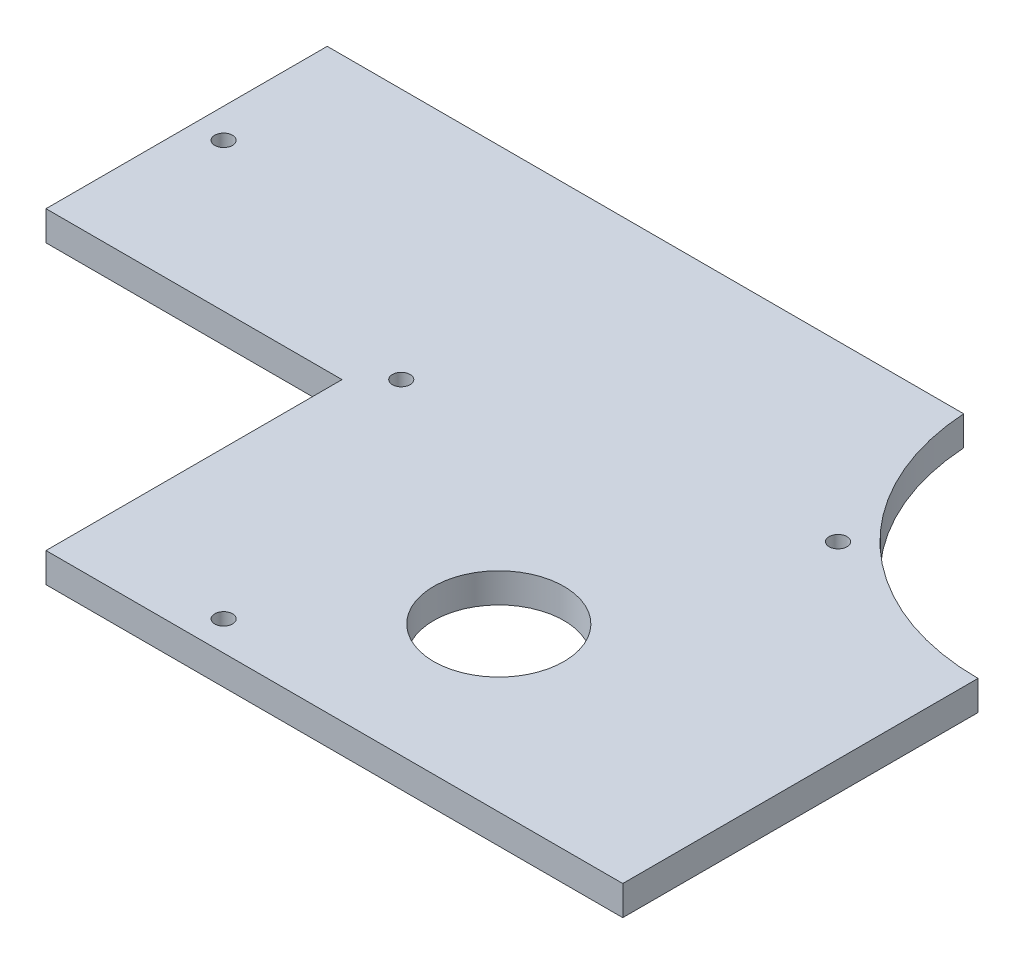
ISO-10303-21;
HEADER;
FILE_DESCRIPTION(('STEP AP214'),'2;1');
FILE_NAME('part.step','',(''),(''),'','','');
FILE_SCHEMA(('AUTOMOTIVE_DESIGN { 1 0 10303 214 1 1 1 1 }'));
ENDSEC;
DATA;
#1=APPLICATION_CONTEXT('core data for automotive mechanical design processes');
#2=APPLICATION_PROTOCOL_DEFINITION('international standard','automotive_design',2000,#1);
#3=PRODUCT_CONTEXT('',#1,'mechanical');
#4=PRODUCT('Part','Part','',(#3));
#5=PRODUCT_RELATED_PRODUCT_CATEGORY('part','',(#4));
#6=PRODUCT_DEFINITION_FORMATION('','',#4);
#7=PRODUCT_DEFINITION_CONTEXT('part definition',#1,'design');
#8=PRODUCT_DEFINITION('design','',#6,#7);
#9=PRODUCT_DEFINITION_SHAPE('','',#8);
#10=(LENGTH_UNIT() NAMED_UNIT(*) SI_UNIT(.MILLI.,.METRE.));
#11=(NAMED_UNIT(*) PLANE_ANGLE_UNIT() SI_UNIT($,.RADIAN.));
#12=(NAMED_UNIT(*) SI_UNIT($,.STERADIAN.) SOLID_ANGLE_UNIT());
#13=UNCERTAINTY_MEASURE_WITH_UNIT(LENGTH_MEASURE(1.E-05),#10,'distance_accuracy_value','');
#14=(GEOMETRIC_REPRESENTATION_CONTEXT(3) GLOBAL_UNCERTAINTY_ASSIGNED_CONTEXT((#13)) GLOBAL_UNIT_ASSIGNED_CONTEXT((#10,
#11,#12)) REPRESENTATION_CONTEXT('',''));
#15=CARTESIAN_POINT('',(0.,0.,0.));
#16=DIRECTION('',(0.,0.,1.));
#17=DIRECTION('',(1.,0.,0.));
#18=AXIS2_PLACEMENT_3D('',#15,#16,#17);
#19=CARTESIAN_POINT('',(0.,5.,-2.585));
#20=DIRECTION('',(0.,-1.,0.));
#21=DIRECTION('',(0.,0.,-1.));
#22=AXIS2_PLACEMENT_3D('',#19,#20,#21);
#23=CYLINDRICAL_SURFACE('',#22,40.);
#24=CARTESIAN_POINT('',(0.,0.,-2.585));
#25=DIRECTION('',(0.,1.,0.));
#26=DIRECTION('',(0.,0.,1.));
#27=AXIS2_PLACEMENT_3D('',#24,#25,#26);
#28=CIRCLE('',#27,40.);
#29=CARTESIAN_POINT('',(-39.9217985566783,0.,-0.0849999999999901));
#30=VERTEX_POINT('',#29);
#31=CARTESIAN_POINT('',(0.,0.,37.415));
#32=VERTEX_POINT('',#31);
#33=EDGE_CURVE('E139',#30,#32,#28,.T.);
#34=ORIENTED_EDGE('',*,*,#33,.F.);
#35=DIRECTION('',(0.,-1.,0.));
#36=VECTOR('',#35,1.);
#37=CARTESIAN_POINT('',(-39.9217985566783,5.,-0.0849999999999901));
#38=LINE('',#37,#36);
#39=CARTESIAN_POINT('',(-39.9217985566783,5.,-0.0849999999999901));
#40=VERTEX_POINT('',#39);
#41=EDGE_CURVE('E11',#40,#30,#38,.T.);
#42=ORIENTED_EDGE('',*,*,#41,.F.);
#43=CARTESIAN_POINT('',(0.,5.,-2.585));
#44=DIRECTION('',(0.,1.,0.));
#45=DIRECTION('',(0.,0.,1.));
#46=AXIS2_PLACEMENT_3D('',#43,#44,#45);
#47=CIRCLE('',#46,40.);
#48=CARTESIAN_POINT('',(0.,5.,37.415));
#49=VERTEX_POINT('',#48);
#50=EDGE_CURVE('E188',#40,#49,#47,.T.);
#51=ORIENTED_EDGE('',*,*,#50,.T.);
#52=DIRECTION('',(0.,-1.,0.));
#53=VECTOR('',#52,1.);
#54=CARTESIAN_POINT('',(0.,5.,37.415));
#55=LINE('',#54,#53);
#56=EDGE_CURVE('E83',#49,#32,#55,.T.);
#57=ORIENTED_EDGE('',*,*,#56,.T.);
#58=EDGE_LOOP('',(#34,#42,#51,#57));
#59=FACE_BOUND('',#58,.T.);
#60=ADVANCED_FACE('F35',(#59),#23,.F.);
#61=CARTESIAN_POINT('',(0.,5.,-0.0849999999999924));
#62=DIRECTION('',(0.,0.,-1.));
#63=DIRECTION('',(-1.,0.,0.));
#64=AXIS2_PLACEMENT_3D('',#61,#62,#63);
#65=PLANE('',#64);
#66=DIRECTION('',(1.,0.,0.));
#67=VECTOR('',#66,1.);
#68=CARTESIAN_POINT('',(0.,0.,-0.0849999999999924));
#69=LINE('',#68,#67);
#70=CARTESIAN_POINT('',(-147.415,0.,-0.0849999999999878));
#71=VERTEX_POINT('',#70);
#72=EDGE_CURVE('E142',#71,#30,#69,.T.);
#73=ORIENTED_EDGE('',*,*,#72,.F.);
#74=DIRECTION('',(0.,-1.,0.));
#75=VECTOR('',#74,1.);
#76=CARTESIAN_POINT('',(-147.415,5.,-0.0849999999999878));
#77=LINE('',#76,#75);
#78=CARTESIAN_POINT('',(-147.415,5.,-0.0849999999999878));
#79=VERTEX_POINT('',#78);
#80=EDGE_CURVE('E44',#79,#71,#77,.T.);
#81=ORIENTED_EDGE('',*,*,#80,.F.);
#82=DIRECTION('',(1.,0.,0.));
#83=VECTOR('',#82,1.);
#84=CARTESIAN_POINT('',(0.,5.,-0.0849999999999924));
#85=LINE('',#84,#83);
#86=EDGE_CURVE('E186',#79,#40,#85,.T.);
#87=ORIENTED_EDGE('',*,*,#86,.T.);
#88=ORIENTED_EDGE('',*,*,#41,.T.);
#89=EDGE_LOOP('',(#73,#81,#87,#88));
#90=FACE_BOUND('',#89,.T.);
#91=ADVANCED_FACE('F179',(#90),#65,.T.);
#92=CARTESIAN_POINT('',(-147.415,5.,0.));
#93=DIRECTION('',(-1.,0.,0.));
#94=DIRECTION('',(0.,0.,1.));
#95=AXIS2_PLACEMENT_3D('',#92,#93,#94);
#96=PLANE('',#95);
#97=DIRECTION('',(0.,0.,-1.));
#98=VECTOR('',#97,1.);
#99=CARTESIAN_POINT('',(-147.415,0.,0.));
#100=LINE('',#99,#98);
#101=CARTESIAN_POINT('',(-147.415,0.,47.415));
#102=VERTEX_POINT('',#101);
#103=EDGE_CURVE('E145',#102,#71,#100,.T.);
#104=ORIENTED_EDGE('',*,*,#103,.F.);
#105=DIRECTION('',(0.,-1.,0.));
#106=VECTOR('',#105,1.);
#107=CARTESIAN_POINT('',(-147.415,5.,47.415));
#108=LINE('',#107,#106);
#109=CARTESIAN_POINT('',(-147.415,5.,47.415));
#110=VERTEX_POINT('',#109);
#111=EDGE_CURVE('E169',#110,#102,#108,.T.);
#112=ORIENTED_EDGE('',*,*,#111,.F.);
#113=DIRECTION('',(0.,0.,-1.));
#114=VECTOR('',#113,1.);
#115=CARTESIAN_POINT('',(-147.415,5.,0.));
#116=LINE('',#115,#114);
#117=EDGE_CURVE('E175',#110,#79,#116,.T.);
#118=ORIENTED_EDGE('',*,*,#117,.T.);
#119=ORIENTED_EDGE('',*,*,#80,.T.);
#120=EDGE_LOOP('',(#104,#112,#118,#119));
#121=FACE_BOUND('',#120,.T.);
#122=ADVANCED_FACE('F174',(#121),#96,.T.);
#123=CARTESIAN_POINT('',(0.,5.,47.4149999999999));
#124=DIRECTION('',(0.,0.,-1.));
#125=DIRECTION('',(-1.,0.,0.));
#126=AXIS2_PLACEMENT_3D('',#123,#124,#125);
#127=PLANE('',#126);
#128=DIRECTION('',(1.,0.,0.));
#129=VECTOR('',#128,1.);
#130=CARTESIAN_POINT('',(0.,0.,47.4149999999999));
#131=LINE('',#130,#129);
#132=CARTESIAN_POINT('',(-97.415,0.,47.415));
#133=VERTEX_POINT('',#132);
#134=EDGE_CURVE('E148',#102,#133,#131,.T.);
#135=ORIENTED_EDGE('',*,*,#134,.T.);
#136=DIRECTION('',(0.,-1.,0.));
#137=VECTOR('',#136,1.);
#138=CARTESIAN_POINT('',(-97.415,5.,47.415));
#139=LINE('',#138,#137);
#140=CARTESIAN_POINT('',(-97.415,5.,47.415));
#141=VERTEX_POINT('',#140);
#142=EDGE_CURVE('E117',#141,#133,#139,.T.);
#143=ORIENTED_EDGE('',*,*,#142,.F.);
#144=DIRECTION('',(1.,0.,0.));
#145=VECTOR('',#144,1.);
#146=CARTESIAN_POINT('',(0.,5.,47.4149999999999));
#147=LINE('',#146,#145);
#148=EDGE_CURVE('E105',#110,#141,#147,.T.);
#149=ORIENTED_EDGE('',*,*,#148,.F.);
#150=ORIENTED_EDGE('',*,*,#111,.T.);
#151=EDGE_LOOP('',(#135,#143,#149,#150));
#152=FACE_BOUND('',#151,.T.);
#153=ADVANCED_FACE('F185',(#152),#127,.F.);
#154=CARTESIAN_POINT('',(-97.415,5.,0.));
#155=DIRECTION('',(1.,0.,0.));
#156=DIRECTION('',(0.,0.,-1.));
#157=AXIS2_PLACEMENT_3D('',#154,#155,#156);
#158=PLANE('',#157);
#159=DIRECTION('',(0.,0.,1.));
#160=VECTOR('',#159,1.);
#161=CARTESIAN_POINT('',(-97.415,0.,0.));
#162=LINE('',#161,#160);
#163=CARTESIAN_POINT('',(-97.415,0.,97.415));
#164=VERTEX_POINT('',#163);
#165=EDGE_CURVE('E113',#133,#164,#162,.T.);
#166=ORIENTED_EDGE('',*,*,#165,.T.);
#167=DIRECTION('',(0.,-1.,0.));
#168=VECTOR('',#167,1.);
#169=CARTESIAN_POINT('',(-97.415,5.,97.415));
#170=LINE('',#169,#168);
#171=CARTESIAN_POINT('',(-97.415,5.,97.415));
#172=VERTEX_POINT('',#171);
#173=EDGE_CURVE('E111',#172,#164,#170,.T.);
#174=ORIENTED_EDGE('',*,*,#173,.F.);
#175=DIRECTION('',(0.,0.,1.));
#176=VECTOR('',#175,1.);
#177=CARTESIAN_POINT('',(-97.415,5.,0.));
#178=LINE('',#177,#176);
#179=EDGE_CURVE('E97',#141,#172,#178,.T.);
#180=ORIENTED_EDGE('',*,*,#179,.F.);
#181=ORIENTED_EDGE('',*,*,#142,.T.);
#182=EDGE_LOOP('',(#166,#174,#180,#181));
#183=FACE_BOUND('',#182,.T.);
#184=ADVANCED_FACE('F112',(#183),#158,.F.);
#185=CARTESIAN_POINT('',(0.,5.,97.4149999999999));
#186=DIRECTION('',(0.,0.,1.));
#187=DIRECTION('',(1.,0.,0.));
#188=AXIS2_PLACEMENT_3D('',#185,#186,#187);
#189=PLANE('',#188);
#190=DIRECTION('',(-1.,0.,0.));
#191=VECTOR('',#190,1.);
#192=CARTESIAN_POINT('',(0.,0.,97.4149999999999));
#193=LINE('',#192,#191);
#194=CARTESIAN_POINT('',(0.,0.,97.4149999999999));
#195=VERTEX_POINT('',#194);
#196=EDGE_CURVE('E152',#195,#164,#193,.T.);
#197=ORIENTED_EDGE('',*,*,#196,.F.);
#198=DIRECTION('',(0.,-1.,0.));
#199=VECTOR('',#198,1.);
#200=CARTESIAN_POINT('',(0.,5.,97.4149999999999));
#201=LINE('',#200,#199);
#202=CARTESIAN_POINT('',(0.,5.,97.4149999999999));
#203=VERTEX_POINT('',#202);
#204=EDGE_CURVE('E76',#203,#195,#201,.T.);
#205=ORIENTED_EDGE('',*,*,#204,.F.);
#206=DIRECTION('',(-1.,0.,0.));
#207=VECTOR('',#206,1.);
#208=CARTESIAN_POINT('',(0.,5.,97.4149999999999));
#209=LINE('',#208,#207);
#210=EDGE_CURVE('E102',#203,#172,#209,.T.);
#211=ORIENTED_EDGE('',*,*,#210,.T.);
#212=ORIENTED_EDGE('',*,*,#173,.T.);
#213=EDGE_LOOP('',(#197,#205,#211,#212));
#214=FACE_BOUND('',#213,.T.);
#215=ADVANCED_FACE('F119',(#214),#189,.T.);
#216=CARTESIAN_POINT('',(-142.415,5.,22.415));
#217=DIRECTION('',(0.,-1.,0.));
#218=DIRECTION('',(0.,0.,-1.));
#219=AXIS2_PLACEMENT_3D('',#216,#217,#218);
#220=CYLINDRICAL_SURFACE('',#219,1.5);
#221=CARTESIAN_POINT('',(-142.415,5.,22.415));
#222=DIRECTION('',(0.,1.,0.));
#223=DIRECTION('',(0.,0.,1.));
#224=AXIS2_PLACEMENT_3D('',#221,#222,#223);
#225=CIRCLE('',#224,1.5);
#226=CARTESIAN_POINT('',(-142.415,5.,23.915));
#227=VERTEX_POINT('',#226);
#228=EDGE_CURVE('E127',#227,#227,#225,.T.);
#229=ORIENTED_EDGE('',*,*,#228,.T.);
#230=EDGE_LOOP('',(#229));
#231=FACE_BOUND('',#230,.T.);
#232=CARTESIAN_POINT('',(-142.415,0.,22.415));
#233=DIRECTION('',(0.,1.,0.));
#234=DIRECTION('',(0.,0.,1.));
#235=AXIS2_PLACEMENT_3D('',#232,#233,#234);
#236=CIRCLE('',#235,1.5);
#237=CARTESIAN_POINT('',(-142.415,0.,23.915));
#238=VERTEX_POINT('',#237);
#239=EDGE_CURVE('E159',#238,#238,#236,.T.);
#240=ORIENTED_EDGE('',*,*,#239,.F.);
#241=EDGE_LOOP('',(#240));
#242=FACE_BOUND('',#241,.T.);
#243=ADVANCED_FACE('F233',(#231,#242),#220,.F.);
#244=CARTESIAN_POINT('',(-72.4149999999999,5.,92.415));
#245=DIRECTION('',(0.,-1.,0.));
#246=DIRECTION('',(0.,0.,-1.));
#247=AXIS2_PLACEMENT_3D('',#244,#245,#246);
#248=CYLINDRICAL_SURFACE('',#247,1.5);
#249=CARTESIAN_POINT('',(-72.4149999999999,5.,92.415));
#250=DIRECTION('',(0.,1.,0.));
#251=DIRECTION('',(0.,0.,1.));
#252=AXIS2_PLACEMENT_3D('',#249,#250,#251);
#253=CIRCLE('',#252,1.5);
#254=CARTESIAN_POINT('',(-72.4149999999999,5.,93.915));
#255=VERTEX_POINT('',#254);
#256=EDGE_CURVE('E121',#255,#255,#253,.T.);
#257=ORIENTED_EDGE('',*,*,#256,.T.);
#258=EDGE_LOOP('',(#257));
#259=FACE_BOUND('',#258,.T.);
#260=CARTESIAN_POINT('',(-72.4149999999999,0.,92.415));
#261=DIRECTION('',(0.,1.,0.));
#262=DIRECTION('',(0.,0.,1.));
#263=AXIS2_PLACEMENT_3D('',#260,#261,#262);
#264=CIRCLE('',#263,1.5);
#265=CARTESIAN_POINT('',(-72.4149999999999,0.,93.915));
#266=VERTEX_POINT('',#265);
#267=EDGE_CURVE('E156',#266,#266,#264,.T.);
#268=ORIENTED_EDGE('',*,*,#267,.F.);
#269=EDGE_LOOP('',(#268));
#270=FACE_BOUND('',#269,.T.);
#271=ADVANCED_FACE('F236',(#259,#270),#248,.F.);
#272=CARTESIAN_POINT('',(0.,5.,0.));
#273=DIRECTION('',(-1.,0.,0.));
#274=DIRECTION('',(0.,0.,1.));
#275=AXIS2_PLACEMENT_3D('',#272,#273,#274);
#276=PLANE('',#275);
#277=DIRECTION('',(0.,0.,-1.));
#278=VECTOR('',#277,1.);
#279=CARTESIAN_POINT('',(0.,0.,0.));
#280=LINE('',#279,#278);
#281=EDGE_CURVE('E154',#195,#32,#280,.T.);
#282=ORIENTED_EDGE('',*,*,#281,.T.);
#283=ORIENTED_EDGE('',*,*,#56,.F.);
#284=DIRECTION('',(0.,0.,-1.));
#285=VECTOR('',#284,1.);
#286=CARTESIAN_POINT('',(0.,5.,0.));
#287=LINE('',#286,#285);
#288=EDGE_CURVE('E52',#203,#49,#287,.T.);
#289=ORIENTED_EDGE('',*,*,#288,.F.);
#290=ORIENTED_EDGE('',*,*,#204,.T.);
#291=EDGE_LOOP('',(#282,#283,#289,#290));
#292=FACE_BOUND('',#291,.T.);
#293=ADVANCED_FACE('F209',(#292),#276,.F.);
#294=CARTESIAN_POINT('',(-31.8198051533946,5.,29.2348051533946));
#295=DIRECTION('',(0.,-1.,0.));
#296=DIRECTION('',(0.,0.,-1.));
#297=AXIS2_PLACEMENT_3D('',#294,#295,#296);
#298=CYLINDRICAL_SURFACE('',#297,1.49999999999999);
#299=CARTESIAN_POINT('',(-31.8198051533946,5.,29.2348051533946));
#300=DIRECTION('',(0.,1.,0.));
#301=DIRECTION('',(0.,0.,1.));
#302=AXIS2_PLACEMENT_3D('',#299,#300,#301);
#303=CIRCLE('',#302,1.49999999999999);
#304=CARTESIAN_POINT('',(-31.8198051533946,5.,30.7348051533946));
#305=VERTEX_POINT('',#304);
#306=EDGE_CURVE('E192',#305,#305,#303,.T.);
#307=ORIENTED_EDGE('',*,*,#306,.T.);
#308=EDGE_LOOP('',(#307));
#309=FACE_BOUND('',#308,.T.);
#310=CARTESIAN_POINT('',(-31.8198051533946,0.,29.2348051533946));
#311=DIRECTION('',(0.,1.,0.));
#312=DIRECTION('',(0.,0.,1.));
#313=AXIS2_PLACEMENT_3D('',#310,#311,#312);
#314=CIRCLE('',#313,1.49999999999999);
#315=CARTESIAN_POINT('',(-31.8198051533946,0.,30.7348051533946));
#316=VERTEX_POINT('',#315);
#317=EDGE_CURVE('E136',#316,#316,#314,.T.);
#318=ORIENTED_EDGE('',*,*,#317,.F.);
#319=EDGE_LOOP('',(#318));
#320=FACE_BOUND('',#319,.T.);
#321=ADVANCED_FACE('F206',(#309,#320),#298,.F.);
#322=CARTESIAN_POINT('',(-48.4354494302725,5.,69.915));
#323=DIRECTION('',(0.,-1.,0.));
#324=DIRECTION('',(0.,0.,-1.));
#325=AXIS2_PLACEMENT_3D('',#322,#323,#324);
#326=CYLINDRICAL_SURFACE('',#325,11.);
#327=CARTESIAN_POINT('',(-48.4354494302725,5.,69.915));
#328=DIRECTION('',(0.,1.,0.));
#329=DIRECTION('',(0.,0.,1.));
#330=AXIS2_PLACEMENT_3D('',#327,#328,#329);
#331=CIRCLE('',#330,11.);
#332=CARTESIAN_POINT('',(-48.4354494302725,5.,80.915));
#333=VERTEX_POINT('',#332);
#334=EDGE_CURVE('E165',#333,#333,#331,.T.);
#335=ORIENTED_EDGE('',*,*,#334,.T.);
#336=EDGE_LOOP('',(#335));
#337=FACE_BOUND('',#336,.T.);
#338=CARTESIAN_POINT('',(-48.4354494302725,0.,69.915));
#339=DIRECTION('',(0.,1.,0.));
#340=DIRECTION('',(0.,0.,1.));
#341=AXIS2_PLACEMENT_3D('',#338,#339,#340);
#342=CIRCLE('',#341,11.);
#343=CARTESIAN_POINT('',(-48.4354494302725,0.,80.915));
#344=VERTEX_POINT('',#343);
#345=EDGE_CURVE('E133',#344,#344,#342,.T.);
#346=ORIENTED_EDGE('',*,*,#345,.F.);
#347=EDGE_LOOP('',(#346));
#348=FACE_BOUND('',#347,.T.);
#349=ADVANCED_FACE('F37',(#337,#348),#326,.F.);
#350=CARTESIAN_POINT('',(-92.4149999999999,5.,42.415));
#351=DIRECTION('',(0.,-1.,0.));
#352=DIRECTION('',(0.,0.,-1.));
#353=AXIS2_PLACEMENT_3D('',#350,#351,#352);
#354=CYLINDRICAL_SURFACE('',#353,1.5);
#355=CARTESIAN_POINT('',(-92.4149999999999,5.,42.415));
#356=DIRECTION('',(0.,1.,0.));
#357=DIRECTION('',(0.,0.,1.));
#358=AXIS2_PLACEMENT_3D('',#355,#356,#357);
#359=CIRCLE('',#358,1.5);
#360=CARTESIAN_POINT('',(-92.4149999999999,5.,43.915));
#361=VERTEX_POINT('',#360);
#362=EDGE_CURVE('E130',#361,#361,#359,.T.);
#363=ORIENTED_EDGE('',*,*,#362,.T.);
#364=EDGE_LOOP('',(#363));
#365=FACE_BOUND('',#364,.T.);
#366=CARTESIAN_POINT('',(-92.4149999999999,0.,42.415));
#367=DIRECTION('',(0.,1.,0.));
#368=DIRECTION('',(0.,0.,1.));
#369=AXIS2_PLACEMENT_3D('',#366,#367,#368);
#370=CIRCLE('',#369,1.5);
#371=CARTESIAN_POINT('',(-92.4149999999999,0.,43.915));
#372=VERTEX_POINT('',#371);
#373=EDGE_CURVE('E162',#372,#372,#370,.T.);
#374=ORIENTED_EDGE('',*,*,#373,.F.);
#375=EDGE_LOOP('',(#374));
#376=FACE_BOUND('',#375,.T.);
#377=ADVANCED_FACE('F202',(#365,#376),#354,.F.);
#378=CARTESIAN_POINT('',(0.,5.,0.));
#379=DIRECTION('',(0.,1.,0.));
#380=DIRECTION('',(0.,0.,1.));
#381=AXIS2_PLACEMENT_3D('',#378,#379,#380);
#382=PLANE('',#381);
#383=ORIENTED_EDGE('',*,*,#334,.F.);
#384=EDGE_LOOP('',(#383));
#385=FACE_BOUND('',#384,.T.);
#386=ORIENTED_EDGE('',*,*,#306,.F.);
#387=EDGE_LOOP('',(#386));
#388=FACE_BOUND('',#387,.T.);
#389=ORIENTED_EDGE('',*,*,#50,.F.);
#390=ORIENTED_EDGE('',*,*,#86,.F.);
#391=ORIENTED_EDGE('',*,*,#117,.F.);
#392=ORIENTED_EDGE('',*,*,#148,.T.);
#393=ORIENTED_EDGE('',*,*,#179,.T.);
#394=ORIENTED_EDGE('',*,*,#210,.F.);
#395=ORIENTED_EDGE('',*,*,#288,.T.);
#396=EDGE_LOOP('',(#389,#390,#391,#392,#393,#394,#395));
#397=FACE_BOUND('',#396,.T.);
#398=ORIENTED_EDGE('',*,*,#256,.F.);
#399=EDGE_LOOP('',(#398));
#400=FACE_BOUND('',#399,.T.);
#401=ORIENTED_EDGE('',*,*,#228,.F.);
#402=EDGE_LOOP('',(#401));
#403=FACE_BOUND('',#402,.T.);
#404=ORIENTED_EDGE('',*,*,#362,.F.);
#405=EDGE_LOOP('',(#404));
#406=FACE_BOUND('',#405,.T.);
#407=ADVANCED_FACE('F99',(#385,#388,#397,#400,#403,#406),#382,.T.);
#408=CARTESIAN_POINT('',(0.,0.,0.));
#409=DIRECTION('',(0.,1.,0.));
#410=DIRECTION('',(0.,0.,1.));
#411=AXIS2_PLACEMENT_3D('',#408,#409,#410);
#412=PLANE('',#411);
#413=ORIENTED_EDGE('',*,*,#345,.T.);
#414=EDGE_LOOP('',(#413));
#415=FACE_BOUND('',#414,.T.);
#416=ORIENTED_EDGE('',*,*,#317,.T.);
#417=EDGE_LOOP('',(#416));
#418=FACE_BOUND('',#417,.T.);
#419=ORIENTED_EDGE('',*,*,#33,.T.);
#420=ORIENTED_EDGE('',*,*,#281,.F.);
#421=ORIENTED_EDGE('',*,*,#196,.T.);
#422=ORIENTED_EDGE('',*,*,#165,.F.);
#423=ORIENTED_EDGE('',*,*,#134,.F.);
#424=ORIENTED_EDGE('',*,*,#103,.T.);
#425=ORIENTED_EDGE('',*,*,#72,.T.);
#426=EDGE_LOOP('',(#419,#420,#421,#422,#423,#424,#425));
#427=FACE_BOUND('',#426,.T.);
#428=ORIENTED_EDGE('',*,*,#267,.T.);
#429=EDGE_LOOP('',(#428));
#430=FACE_BOUND('',#429,.T.);
#431=ORIENTED_EDGE('',*,*,#239,.T.);
#432=EDGE_LOOP('',(#431));
#433=FACE_BOUND('',#432,.T.);
#434=ORIENTED_EDGE('',*,*,#373,.T.);
#435=EDGE_LOOP('',(#434));
#436=FACE_BOUND('',#435,.T.);
#437=ADVANCED_FACE('F182',(#415,#418,#427,#430,#433,#436),#412,.F.);
#438=CLOSED_SHELL('',(#60,#91,#122,#153,#184,#215,#243,#271,#293,#321,#349,#377,#407,#437));
#439=MANIFOLD_SOLID_BREP('B2',#438);
#440=ADVANCED_BREP_SHAPE_REPRESENTATION('',(#18,#439),#14);
#441=SHAPE_DEFINITION_REPRESENTATION(#9,#440);
ENDSEC;
END-ISO-10303-21;
